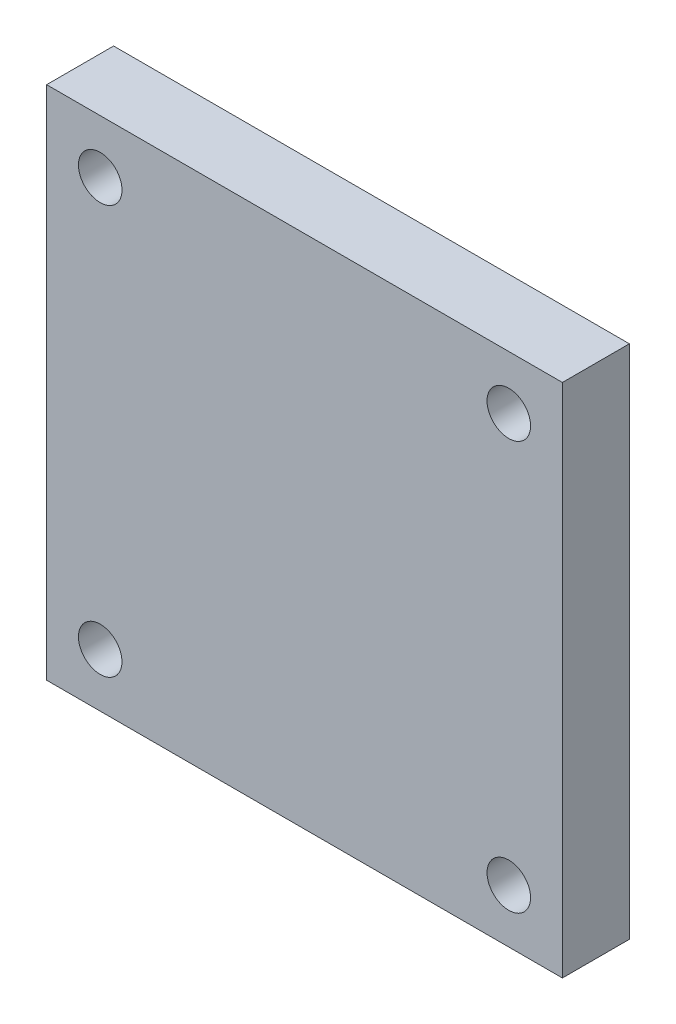
ISO-10303-21;
HEADER;
FILE_DESCRIPTION(('STEP AP214'),'2;1');
FILE_NAME('part.step','',(''),(''),'','','');
FILE_SCHEMA(('AUTOMOTIVE_DESIGN { 1 0 10303 214 1 1 1 1 }'));
ENDSEC;
DATA;
#1=APPLICATION_CONTEXT('core data for automotive mechanical design processes');
#2=APPLICATION_PROTOCOL_DEFINITION('international standard','automotive_design',2000,#1);
#3=PRODUCT_CONTEXT('',#1,'mechanical');
#4=PRODUCT('Part','Part','',(#3));
#5=PRODUCT_RELATED_PRODUCT_CATEGORY('part','',(#4));
#6=PRODUCT_DEFINITION_FORMATION('','',#4);
#7=PRODUCT_DEFINITION_CONTEXT('part definition',#1,'design');
#8=PRODUCT_DEFINITION('design','',#6,#7);
#9=PRODUCT_DEFINITION_SHAPE('','',#8);
#10=(LENGTH_UNIT() NAMED_UNIT(*) SI_UNIT(.MILLI.,.METRE.));
#11=(NAMED_UNIT(*) PLANE_ANGLE_UNIT() SI_UNIT($,.RADIAN.));
#12=(NAMED_UNIT(*) SI_UNIT($,.STERADIAN.) SOLID_ANGLE_UNIT());
#13=UNCERTAINTY_MEASURE_WITH_UNIT(LENGTH_MEASURE(1.E-05),#10,'distance_accuracy_value','');
#14=(GEOMETRIC_REPRESENTATION_CONTEXT(3) GLOBAL_UNCERTAINTY_ASSIGNED_CONTEXT((#13)) GLOBAL_UNIT_ASSIGNED_CONTEXT((#10,
#11,#12)) REPRESENTATION_CONTEXT('',''));
#15=CARTESIAN_POINT('',(0.,0.,0.));
#16=DIRECTION('',(0.,0.,1.));
#17=DIRECTION('',(1.,0.,0.));
#18=AXIS2_PLACEMENT_3D('',#15,#16,#17);
#19=CARTESIAN_POINT('',(0.,0.,10.));
#20=DIRECTION('',(0.,0.,-1.));
#21=DIRECTION('',(-1.,0.,0.));
#22=AXIS2_PLACEMENT_3D('',#19,#20,#21);
#23=PLANE('',#22);
#24=DIRECTION('',(0.,-1.,0.));
#25=VECTOR('',#24,1.);
#26=CARTESIAN_POINT('',(-77.,-77.,10.));
#27=LINE('',#26,#25);
#28=CARTESIAN_POINT('',(-77.,77.,10.));
#29=VERTEX_POINT('',#28);
#30=CARTESIAN_POINT('',(-77.,-77.,10.));
#31=VERTEX_POINT('',#30);
#32=EDGE_CURVE('E84',#29,#31,#27,.T.);
#33=ORIENTED_EDGE('',*,*,#32,.T.);
#34=DIRECTION('',(1.,0.,0.));
#35=VECTOR('',#34,1.);
#36=CARTESIAN_POINT('',(-77.,-77.,10.));
#37=LINE('',#36,#35);
#38=CARTESIAN_POINT('',(77.,-77.,10.));
#39=VERTEX_POINT('',#38);
#40=EDGE_CURVE('E79',#31,#39,#37,.T.);
#41=ORIENTED_EDGE('',*,*,#40,.T.);
#42=DIRECTION('',(0.,1.,0.));
#43=VECTOR('',#42,1.);
#44=CARTESIAN_POINT('',(77.,-77.,10.));
#45=LINE('',#44,#43);
#46=CARTESIAN_POINT('',(77.,77.,10.));
#47=VERTEX_POINT('',#46);
#48=EDGE_CURVE('E82',#39,#47,#45,.T.);
#49=ORIENTED_EDGE('',*,*,#48,.T.);
#50=DIRECTION('',(-1.,0.,0.));
#51=VECTOR('',#50,1.);
#52=CARTESIAN_POINT('',(-77.,77.,10.));
#53=LINE('',#52,#51);
#54=EDGE_CURVE('E49',#47,#29,#53,.T.);
#55=ORIENTED_EDGE('',*,*,#54,.T.);
#56=EDGE_LOOP('',(#33,#41,#49,#55));
#57=FACE_BOUND('',#56,.T.);
#58=CARTESIAN_POINT('',(-61.,61.,10.));
#59=DIRECTION('',(0.,0.,1.));
#60=DIRECTION('',(1.,0.,0.));
#61=AXIS2_PLACEMENT_3D('',#58,#59,#60);
#62=CIRCLE('',#61,6.50000000000003);
#63=CARTESIAN_POINT('',(-54.5,61.,10.));
#64=VERTEX_POINT('',#63);
#65=EDGE_CURVE('E99',#64,#64,#62,.T.);
#66=ORIENTED_EDGE('',*,*,#65,.F.);
#67=EDGE_LOOP('',(#66));
#68=FACE_BOUND('',#67,.T.);
#69=CARTESIAN_POINT('',(61.,61.,10.));
#70=DIRECTION('',(0.,0.,1.));
#71=DIRECTION('',(-1.,0.,0.));
#72=AXIS2_PLACEMENT_3D('',#69,#70,#71);
#73=CIRCLE('',#72,6.5);
#74=CARTESIAN_POINT('',(54.5,61.,10.));
#75=VERTEX_POINT('',#74);
#76=EDGE_CURVE('E114',#75,#75,#73,.T.);
#77=ORIENTED_EDGE('',*,*,#76,.F.);
#78=EDGE_LOOP('',(#77));
#79=FACE_BOUND('',#78,.T.);
#80=CARTESIAN_POINT('',(-61.,-61.,10.));
#81=DIRECTION('',(0.,0.,1.));
#82=DIRECTION('',(-1.,0.,0.));
#83=AXIS2_PLACEMENT_3D('',#80,#81,#82);
#84=CIRCLE('',#83,6.50000000000002);
#85=CARTESIAN_POINT('',(-67.5,-61.,10.));
#86=VERTEX_POINT('',#85);
#87=EDGE_CURVE('E120',#86,#86,#84,.T.);
#88=ORIENTED_EDGE('',*,*,#87,.F.);
#89=EDGE_LOOP('',(#88));
#90=FACE_BOUND('',#89,.T.);
#91=CARTESIAN_POINT('',(61.,-61.,10.));
#92=DIRECTION('',(0.,0.,1.));
#93=DIRECTION('',(1.,0.,0.));
#94=AXIS2_PLACEMENT_3D('',#91,#92,#93);
#95=CIRCLE('',#94,6.5);
#96=CARTESIAN_POINT('',(67.5,-61.,10.));
#97=VERTEX_POINT('',#96);
#98=EDGE_CURVE('E126',#97,#97,#95,.T.);
#99=ORIENTED_EDGE('',*,*,#98,.F.);
#100=EDGE_LOOP('',(#99));
#101=FACE_BOUND('',#100,.T.);
#102=ADVANCED_FACE('F32',(#57,#68,#79,#90,#101),#23,.F.);
#103=CARTESIAN_POINT('',(0.,0.,-10.));
#104=DIRECTION('',(0.,0.,-1.));
#105=DIRECTION('',(-1.,0.,0.));
#106=AXIS2_PLACEMENT_3D('',#103,#104,#105);
#107=PLANE('',#106);
#108=CARTESIAN_POINT('',(-61.,-61.,-10.));
#109=DIRECTION('',(0.,0.,1.));
#110=DIRECTION('',(-1.,0.,0.));
#111=AXIS2_PLACEMENT_3D('',#108,#109,#110);
#112=CIRCLE('',#111,6.50000000000002);
#113=CARTESIAN_POINT('',(-67.5,-61.,-10.));
#114=VERTEX_POINT('',#113);
#115=EDGE_CURVE('E123',#114,#114,#112,.T.);
#116=ORIENTED_EDGE('',*,*,#115,.T.);
#117=EDGE_LOOP('',(#116));
#118=FACE_BOUND('',#117,.T.);
#119=CARTESIAN_POINT('',(-61.,61.,-10.));
#120=DIRECTION('',(0.,0.,1.));
#121=DIRECTION('',(1.,0.,0.));
#122=AXIS2_PLACEMENT_3D('',#119,#120,#121);
#123=CIRCLE('',#122,6.50000000000003);
#124=CARTESIAN_POINT('',(-54.5,61.,-10.));
#125=VERTEX_POINT('',#124);
#126=EDGE_CURVE('E111',#125,#125,#123,.T.);
#127=ORIENTED_EDGE('',*,*,#126,.T.);
#128=EDGE_LOOP('',(#127));
#129=FACE_BOUND('',#128,.T.);
#130=DIRECTION('',(0.,-1.,0.));
#131=VECTOR('',#130,1.);
#132=CARTESIAN_POINT('',(-77.,-77.,-10.));
#133=LINE('',#132,#131);
#134=CARTESIAN_POINT('',(-77.,77.,-10.));
#135=VERTEX_POINT('',#134);
#136=CARTESIAN_POINT('',(-77.,-77.,-10.));
#137=VERTEX_POINT('',#136);
#138=EDGE_CURVE('E96',#135,#137,#133,.T.);
#139=ORIENTED_EDGE('',*,*,#138,.F.);
#140=DIRECTION('',(-1.,0.,0.));
#141=VECTOR('',#140,1.);
#142=CARTESIAN_POINT('',(-77.,77.,-10.));
#143=LINE('',#142,#141);
#144=CARTESIAN_POINT('',(77.,77.,-10.));
#145=VERTEX_POINT('',#144);
#146=EDGE_CURVE('E72',#145,#135,#143,.T.);
#147=ORIENTED_EDGE('',*,*,#146,.F.);
#148=DIRECTION('',(0.,1.,0.));
#149=VECTOR('',#148,1.);
#150=CARTESIAN_POINT('',(77.,-77.,-10.));
#151=LINE('',#150,#149);
#152=CARTESIAN_POINT('',(77.,-77.,-10.));
#153=VERTEX_POINT('',#152);
#154=EDGE_CURVE('E66',#153,#145,#151,.T.);
#155=ORIENTED_EDGE('',*,*,#154,.F.);
#156=DIRECTION('',(1.,0.,0.));
#157=VECTOR('',#156,1.);
#158=CARTESIAN_POINT('',(-77.,-77.,-10.));
#159=LINE('',#158,#157);
#160=EDGE_CURVE('E88',#137,#153,#159,.T.);
#161=ORIENTED_EDGE('',*,*,#160,.F.);
#162=EDGE_LOOP('',(#139,#147,#155,#161));
#163=FACE_BOUND('',#162,.T.);
#164=CARTESIAN_POINT('',(61.,61.,-10.));
#165=DIRECTION('',(0.,0.,1.));
#166=DIRECTION('',(-1.,0.,0.));
#167=AXIS2_PLACEMENT_3D('',#164,#165,#166);
#168=CIRCLE('',#167,6.5);
#169=CARTESIAN_POINT('',(54.5,61.,-10.));
#170=VERTEX_POINT('',#169);
#171=EDGE_CURVE('E117',#170,#170,#168,.T.);
#172=ORIENTED_EDGE('',*,*,#171,.T.);
#173=EDGE_LOOP('',(#172));
#174=FACE_BOUND('',#173,.T.);
#175=CARTESIAN_POINT('',(61.,-61.,-10.));
#176=DIRECTION('',(0.,0.,1.));
#177=DIRECTION('',(1.,0.,0.));
#178=AXIS2_PLACEMENT_3D('',#175,#176,#177);
#179=CIRCLE('',#178,6.5);
#180=CARTESIAN_POINT('',(67.5,-61.,-10.));
#181=VERTEX_POINT('',#180);
#182=EDGE_CURVE('E129',#181,#181,#179,.T.);
#183=ORIENTED_EDGE('',*,*,#182,.T.);
#184=EDGE_LOOP('',(#183));
#185=FACE_BOUND('',#184,.T.);
#186=ADVANCED_FACE('F107',(#118,#129,#163,#174,#185),#107,.T.);
#187=CARTESIAN_POINT('',(-77.,-77.,10.));
#188=DIRECTION('',(1.,0.,0.));
#189=DIRECTION('',(0.,0.,-1.));
#190=AXIS2_PLACEMENT_3D('',#187,#188,#189);
#191=PLANE('',#190);
#192=ORIENTED_EDGE('',*,*,#138,.T.);
#193=DIRECTION('',(0.,0.,-1.));
#194=VECTOR('',#193,1.);
#195=CARTESIAN_POINT('',(-77.,-77.,10.));
#196=LINE('',#195,#194);
#197=EDGE_CURVE('E11',#31,#137,#196,.T.);
#198=ORIENTED_EDGE('',*,*,#197,.F.);
#199=ORIENTED_EDGE('',*,*,#32,.F.);
#200=DIRECTION('',(0.,0.,-1.));
#201=VECTOR('',#200,1.);
#202=CARTESIAN_POINT('',(-77.,77.,10.));
#203=LINE('',#202,#201);
#204=EDGE_CURVE('E92',#29,#135,#203,.T.);
#205=ORIENTED_EDGE('',*,*,#204,.T.);
#206=EDGE_LOOP('',(#192,#198,#199,#205));
#207=FACE_BOUND('',#206,.T.);
#208=ADVANCED_FACE('F34',(#207),#191,.F.);
#209=CARTESIAN_POINT('',(-77.,-77.,10.));
#210=DIRECTION('',(0.,1.,0.));
#211=DIRECTION('',(0.,0.,1.));
#212=AXIS2_PLACEMENT_3D('',#209,#210,#211);
#213=PLANE('',#212);
#214=ORIENTED_EDGE('',*,*,#160,.T.);
#215=DIRECTION('',(0.,0.,-1.));
#216=VECTOR('',#215,1.);
#217=CARTESIAN_POINT('',(77.,-77.,10.));
#218=LINE('',#217,#216);
#219=EDGE_CURVE('E41',#39,#153,#218,.T.);
#220=ORIENTED_EDGE('',*,*,#219,.F.);
#221=ORIENTED_EDGE('',*,*,#40,.F.);
#222=ORIENTED_EDGE('',*,*,#197,.T.);
#223=EDGE_LOOP('',(#214,#220,#221,#222));
#224=FACE_BOUND('',#223,.T.);
#225=ADVANCED_FACE('F87',(#224),#213,.F.);
#226=CARTESIAN_POINT('',(77.,-77.,10.));
#227=DIRECTION('',(-1.,0.,0.));
#228=DIRECTION('',(0.,0.,1.));
#229=AXIS2_PLACEMENT_3D('',#226,#227,#228);
#230=PLANE('',#229);
#231=ORIENTED_EDGE('',*,*,#154,.T.);
#232=DIRECTION('',(0.,0.,-1.));
#233=VECTOR('',#232,1.);
#234=CARTESIAN_POINT('',(77.,77.,10.));
#235=LINE('',#234,#233);
#236=EDGE_CURVE('E89',#47,#145,#235,.T.);
#237=ORIENTED_EDGE('',*,*,#236,.F.);
#238=ORIENTED_EDGE('',*,*,#48,.F.);
#239=ORIENTED_EDGE('',*,*,#219,.T.);
#240=EDGE_LOOP('',(#231,#237,#238,#239));
#241=FACE_BOUND('',#240,.T.);
#242=ADVANCED_FACE('F90',(#241),#230,.F.);
#243=CARTESIAN_POINT('',(-77.,77.,10.));
#244=DIRECTION('',(0.,-1.,0.));
#245=DIRECTION('',(0.,0.,-1.));
#246=AXIS2_PLACEMENT_3D('',#243,#244,#245);
#247=PLANE('',#246);
#248=ORIENTED_EDGE('',*,*,#146,.T.);
#249=ORIENTED_EDGE('',*,*,#204,.F.);
#250=ORIENTED_EDGE('',*,*,#54,.F.);
#251=ORIENTED_EDGE('',*,*,#236,.T.);
#252=EDGE_LOOP('',(#248,#249,#250,#251));
#253=FACE_BOUND('',#252,.T.);
#254=ADVANCED_FACE('F104',(#253),#247,.F.);
#255=CARTESIAN_POINT('',(-61.,61.,10.));
#256=DIRECTION('',(0.,0.,-1.));
#257=DIRECTION('',(-1.,0.,0.));
#258=AXIS2_PLACEMENT_3D('',#255,#256,#257);
#259=CYLINDRICAL_SURFACE('',#258,6.50000000000003);
#260=ORIENTED_EDGE('',*,*,#65,.T.);
#261=EDGE_LOOP('',(#260));
#262=FACE_BOUND('',#261,.T.);
#263=ORIENTED_EDGE('',*,*,#126,.F.);
#264=EDGE_LOOP('',(#263));
#265=FACE_BOUND('',#264,.T.);
#266=ADVANCED_FACE('F146',(#262,#265),#259,.F.);
#267=CARTESIAN_POINT('',(61.,61.,10.));
#268=DIRECTION('',(0.,0.,-1.));
#269=DIRECTION('',(-1.,0.,0.));
#270=AXIS2_PLACEMENT_3D('',#267,#268,#269);
#271=CYLINDRICAL_SURFACE('',#270,6.5);
#272=ORIENTED_EDGE('',*,*,#76,.T.);
#273=EDGE_LOOP('',(#272));
#274=FACE_BOUND('',#273,.T.);
#275=ORIENTED_EDGE('',*,*,#171,.F.);
#276=EDGE_LOOP('',(#275));
#277=FACE_BOUND('',#276,.T.);
#278=ADVANCED_FACE('F192',(#274,#277),#271,.F.);
#279=CARTESIAN_POINT('',(-61.,-61.,10.));
#280=DIRECTION('',(0.,0.,-1.));
#281=DIRECTION('',(-1.,0.,0.));
#282=AXIS2_PLACEMENT_3D('',#279,#280,#281);
#283=CYLINDRICAL_SURFACE('',#282,6.50000000000002);
#284=ORIENTED_EDGE('',*,*,#87,.T.);
#285=EDGE_LOOP('',(#284));
#286=FACE_BOUND('',#285,.T.);
#287=ORIENTED_EDGE('',*,*,#115,.F.);
#288=EDGE_LOOP('',(#287));
#289=FACE_BOUND('',#288,.T.);
#290=ADVANCED_FACE('F200',(#286,#289),#283,.F.);
#291=CARTESIAN_POINT('',(61.,-61.,10.));
#292=DIRECTION('',(0.,0.,-1.));
#293=DIRECTION('',(-1.,0.,0.));
#294=AXIS2_PLACEMENT_3D('',#291,#292,#293);
#295=CYLINDRICAL_SURFACE('',#294,6.5);
#296=ORIENTED_EDGE('',*,*,#98,.T.);
#297=EDGE_LOOP('',(#296));
#298=FACE_BOUND('',#297,.T.);
#299=ORIENTED_EDGE('',*,*,#182,.F.);
#300=EDGE_LOOP('',(#299));
#301=FACE_BOUND('',#300,.T.);
#302=ADVANCED_FACE('F135',(#298,#301),#295,.F.);
#303=CLOSED_SHELL('',(#102,#186,#208,#225,#242,#254,#266,#278,#290,#302));
#304=MANIFOLD_SOLID_BREP('B2',#303);
#305=ADVANCED_BREP_SHAPE_REPRESENTATION('',(#18,#304),#14);
#306=SHAPE_DEFINITION_REPRESENTATION(#9,#305);
ENDSEC;
END-ISO-10303-21;
